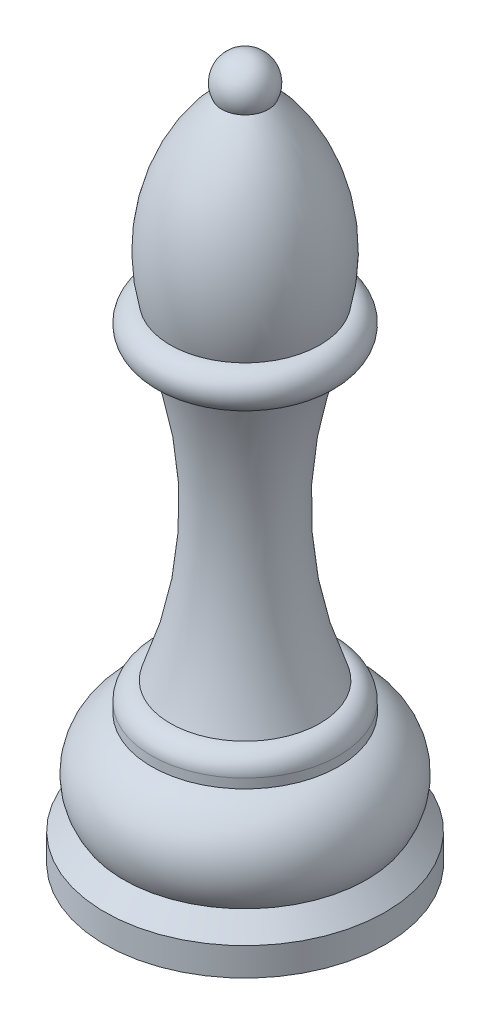
ISO-10303-21;
HEADER;
FILE_DESCRIPTION(('STEP AP214'),'2;1');
FILE_NAME('part.step','',(''),(''),'','','');
FILE_SCHEMA(('AUTOMOTIVE_DESIGN { 1 0 10303 214 1 1 1 1 }'));
ENDSEC;
DATA;
#1=APPLICATION_CONTEXT('core data for automotive mechanical design processes');
#2=APPLICATION_PROTOCOL_DEFINITION('international standard','automotive_design',2000,#1);
#3=PRODUCT_CONTEXT('',#1,'mechanical');
#4=PRODUCT('Part','Part','',(#3));
#5=PRODUCT_RELATED_PRODUCT_CATEGORY('part','',(#4));
#6=PRODUCT_DEFINITION_FORMATION('','',#4);
#7=PRODUCT_DEFINITION_CONTEXT('part definition',#1,'design');
#8=PRODUCT_DEFINITION('design','',#6,#7);
#9=PRODUCT_DEFINITION_SHAPE('','',#8);
#10=(LENGTH_UNIT() NAMED_UNIT(*) SI_UNIT(.MILLI.,.METRE.));
#11=(NAMED_UNIT(*) PLANE_ANGLE_UNIT() SI_UNIT($,.RADIAN.));
#12=(NAMED_UNIT(*) SI_UNIT($,.STERADIAN.) SOLID_ANGLE_UNIT());
#13=UNCERTAINTY_MEASURE_WITH_UNIT(LENGTH_MEASURE(1.E-05),#10,'distance_accuracy_value','');
#14=(GEOMETRIC_REPRESENTATION_CONTEXT(3) GLOBAL_UNCERTAINTY_ASSIGNED_CONTEXT((#13)) GLOBAL_UNIT_ASSIGNED_CONTEXT((#10,
#11,#12)) REPRESENTATION_CONTEXT('',''));
#15=CARTESIAN_POINT('',(0.,0.,0.));
#16=DIRECTION('',(0.,0.,1.));
#17=DIRECTION('',(1.,0.,0.));
#18=AXIS2_PLACEMENT_3D('',#15,#16,#17);
#19=CARTESIAN_POINT('',(-1.97758476261356E-13,56.7049655326048,0.));
#20=DIRECTION('',(0.,-1.,0.));
#21=DIRECTION('',(1.,0.,0.));
#22=AXIS2_PLACEMENT_3D('',#19,#20,#21);
#23=DEGENERATE_TOROIDAL_SURFACE('',#22,11.4362830815554,20.,.F.);
#24=CARTESIAN_POINT('',(-2.48069749124806E-13,71.0500000000001,0.));
#25=DIRECTION('',(0.,-1.,0.));
#26=DIRECTION('',(1.,0.,0.));
#27=AXIS2_PLACEMENT_3D('',#24,#25,#26);
#28=CIRCLE('',#27,2.49999999999975);
#29=CARTESIAN_POINT('',(2.4999999999995,71.0500000000001,0.));
#30=VERTEX_POINT('',#29);
#31=EDGE_CURVE('E82',#30,#30,#28,.T.);
#32=ORIENTED_EDGE('',*,*,#31,.T.);
#33=EDGE_LOOP('',(#32));
#34=FACE_BOUND('',#33,.T.);
#35=CARTESIAN_POINT('',(-1.81522114806455E-13,51.99,0.));
#36=DIRECTION('',(0.,-1.,0.));
#37=DIRECTION('',(1.,0.,0.));
#38=AXIS2_PLACEMENT_3D('',#35,#36,#37);
#39=CIRCLE('',#38,7.99999999999982);
#40=CARTESIAN_POINT('',(7.99999999999964,51.99,0.));
#41=VERTEX_POINT('',#40);
#42=EDGE_CURVE('E10',#41,#41,#39,.T.);
#43=ORIENTED_EDGE('',*,*,#42,.F.);
#44=EDGE_LOOP('',(#43));
#45=FACE_BOUND('',#44,.T.);
#46=ADVANCED_FACE('F39',(#34,#45),#23,.F.);
#47=CARTESIAN_POINT('',(-1.73472347597681E-13,49.99,0.));
#48=DIRECTION('',(0.,-1.,0.));
#49=DIRECTION('',(1.,0.,0.));
#50=AXIS2_PLACEMENT_3D('',#47,#48,#49);
#51=TOROIDAL_SURFACE('',#50,8.00000000004292,2.);
#52=ORIENTED_EDGE('',*,*,#42,.T.);
#53=EDGE_LOOP('',(#52));
#54=FACE_BOUND('',#53,.T.);
#55=CARTESIAN_POINT('',(-1.67556189451082E-13,47.99,0.));
#56=DIRECTION('',(0.,-1.,0.));
#57=DIRECTION('',(1.,0.,0.));
#58=AXIS2_PLACEMENT_3D('',#55,#56,#57);
#59=CIRCLE('',#58,8.00000000004292);
#60=CARTESIAN_POINT('',(8.00000000004276,47.99,0.));
#61=VERTEX_POINT('',#60);
#62=EDGE_CURVE('E46',#61,#61,#59,.T.);
#63=ORIENTED_EDGE('',*,*,#62,.F.);
#64=EDGE_LOOP('',(#63));
#65=FACE_BOUND('',#64,.T.);
#66=ADVANCED_FACE('F100',(#54,#65),#51,.T.);
#67=CARTESIAN_POINT('',(0.,47.99,0.));
#68=DIRECTION('',(0.,-1.,0.));
#69=DIRECTION('',(1.,0.,0.));
#70=AXIS2_PLACEMENT_3D('',#67,#68,#69);
#71=PLANE('',#70);
#72=ORIENTED_EDGE('',*,*,#62,.T.);
#73=EDGE_LOOP('',(#72));
#74=FACE_BOUND('',#73,.T.);
#75=CARTESIAN_POINT('',(-1.67556189451082E-13,47.99,0.));
#76=DIRECTION('',(0.,-1.,0.));
#77=DIRECTION('',(1.,0.,0.));
#78=AXIS2_PLACEMENT_3D('',#75,#76,#77);
#79=CIRCLE('',#78,7.49999999999983);
#80=CARTESIAN_POINT('',(7.49999999999967,47.99,0.));
#81=VERTEX_POINT('',#80);
#82=EDGE_CURVE('E51',#81,#81,#79,.T.);
#83=ORIENTED_EDGE('',*,*,#82,.F.);
#84=EDGE_LOOP('',(#83));
#85=FACE_BOUND('',#84,.T.);
#86=ADVANCED_FACE('F104',(#74,#85),#71,.T.);
#87=CARTESIAN_POINT('',(-1.17961196366423E-13,33.1607931199014,0.));
#88=DIRECTION('',(0.,-1.,0.));
#89=DIRECTION('',(1.,0.,0.));
#90=AXIS2_PLACEMENT_3D('',#87,#88,#89);
#91=TOROIDAL_SURFACE('',#90,49.9864051586766,45.);
#92=ORIENTED_EDGE('',*,*,#82,.T.);
#93=EDGE_LOOP('',(#92));
#94=FACE_BOUND('',#93,.T.);
#95=CARTESIAN_POINT('',(0.,16.97,0.));
#96=DIRECTION('',(0.,-1.,0.));
#97=DIRECTION('',(1.,0.,0.));
#98=AXIS2_PLACEMENT_3D('',#95,#96,#97);
#99=CIRCLE('',#98,7.99999999999994);
#100=CARTESIAN_POINT('',(7.99999999999988,16.9700000000001,0.));
#101=VERTEX_POINT('',#100);
#102=EDGE_CURVE('E56',#101,#101,#99,.T.);
#103=ORIENTED_EDGE('',*,*,#102,.F.);
#104=EDGE_LOOP('',(#103));
#105=FACE_BOUND('',#104,.T.);
#106=ADVANCED_FACE('F108',(#94,#105),#91,.F.);
#107=CARTESIAN_POINT('',(0.,14.97,0.));
#108=DIRECTION('',(0.,-1.,0.));
#109=DIRECTION('',(1.,0.,0.));
#110=AXIS2_PLACEMENT_3D('',#107,#108,#109);
#111=TOROIDAL_SURFACE('',#110,7.99999999999995,2.);
#112=ORIENTED_EDGE('',*,*,#102,.T.);
#113=EDGE_LOOP('',(#112));
#114=FACE_BOUND('',#113,.T.);
#115=CARTESIAN_POINT('',(0.,14.97,0.));
#116=DIRECTION('',(0.,-1.,0.));
#117=DIRECTION('',(1.,0.,0.));
#118=AXIS2_PLACEMENT_3D('',#115,#116,#117);
#119=CIRCLE('',#118,9.99999999999995);
#120=CARTESIAN_POINT('',(9.9999999999999,14.9700000000001,0.));
#121=VERTEX_POINT('',#120);
#122=EDGE_CURVE('E62',#121,#121,#119,.T.);
#123=ORIENTED_EDGE('',*,*,#122,.F.);
#124=EDGE_LOOP('',(#123));
#125=FACE_BOUND('',#124,.T.);
#126=ADVANCED_FACE('F114',(#114,#125),#111,.T.);
#127=CARTESIAN_POINT('',(1.88653052843492E-12,-540.32381827365,0.));
#128=DIRECTION('',(0.,-1.,0.));
#129=DIRECTION('',(1.,0.,0.));
#130=AXIS2_PLACEMENT_3D('',#127,#128,#129);
#131=CYLINDRICAL_SURFACE('',#130,9.99999999999995);
#132=ORIENTED_EDGE('',*,*,#122,.T.);
#133=EDGE_LOOP('',(#132));
#134=FACE_BOUND('',#133,.T.);
#135=CARTESIAN_POINT('',(0.,13.97,0.));
#136=DIRECTION('',(0.,-1.,0.));
#137=DIRECTION('',(1.,0.,0.));
#138=AXIS2_PLACEMENT_3D('',#135,#136,#137);
#139=CIRCLE('',#138,9.99999999999995);
#140=CARTESIAN_POINT('',(9.9999999999999,13.9700000000001,0.));
#141=VERTEX_POINT('',#140);
#142=EDGE_CURVE('E66',#141,#141,#139,.T.);
#143=ORIENTED_EDGE('',*,*,#142,.F.);
#144=EDGE_LOOP('',(#143));
#145=FACE_BOUND('',#144,.T.);
#146=ADVANCED_FACE('F118',(#134,#145),#131,.T.);
#147=CARTESIAN_POINT('',(0.,8.31380661428568,0.));
#148=DIRECTION('',(0.,-1.,0.));
#149=DIRECTION('',(1.,0.,0.));
#150=AXIS2_PLACEMENT_3D('',#147,#148,#149);
#151=TOROIDAL_SURFACE('',#150,7.99813177671415,6.);
#152=ORIENTED_EDGE('',*,*,#142,.T.);
#153=EDGE_LOOP('',(#152));
#154=FACE_BOUND('',#153,.T.);
#155=CARTESIAN_POINT('',(0.,5.,0.));
#156=DIRECTION('',(0.,-1.,0.));
#157=DIRECTION('',(1.,0.,0.));
#158=AXIS2_PLACEMENT_3D('',#155,#156,#157);
#159=CIRCLE('',#158,13.);
#160=CARTESIAN_POINT('',(13.,5.00000000000005,0.));
#161=VERTEX_POINT('',#160);
#162=EDGE_CURVE('E70',#161,#161,#159,.T.);
#163=ORIENTED_EDGE('',*,*,#162,.F.);
#164=EDGE_LOOP('',(#163));
#165=FACE_BOUND('',#164,.T.);
#166=ADVANCED_FACE('F122',(#154,#165),#151,.T.);
#167=CARTESIAN_POINT('',(0.,3.,0.));
#168=DIRECTION('',(0.,-1.,0.));
#169=DIRECTION('',(1.,0.,0.));
#170=AXIS2_PLACEMENT_3D('',#167,#168,#169);
#171=CONICAL_SURFACE('',#170,15.,0.78539816339745);
#172=ORIENTED_EDGE('',*,*,#162,.T.);
#173=EDGE_LOOP('',(#172));
#174=FACE_BOUND('',#173,.T.);
#175=CARTESIAN_POINT('',(0.,3.,0.));
#176=DIRECTION('',(0.,-1.,0.));
#177=DIRECTION('',(1.,0.,0.));
#178=AXIS2_PLACEMENT_3D('',#175,#176,#177);
#179=CIRCLE('',#178,15.);
#180=CARTESIAN_POINT('',(15.,3.00000000000006,0.));
#181=VERTEX_POINT('',#180);
#182=EDGE_CURVE('E74',#181,#181,#179,.T.);
#183=ORIENTED_EDGE('',*,*,#182,.F.);
#184=EDGE_LOOP('',(#183));
#185=FACE_BOUND('',#184,.T.);
#186=ADVANCED_FACE('F126',(#174,#185),#171,.T.);
#187=CARTESIAN_POINT('',(1.88653052843492E-12,-540.32381827365,0.));
#188=DIRECTION('',(0.,-1.,0.));
#189=DIRECTION('',(1.,0.,0.));
#190=AXIS2_PLACEMENT_3D('',#187,#188,#189);
#191=CYLINDRICAL_SURFACE('',#190,15.0000000000215);
#192=ORIENTED_EDGE('',*,*,#182,.T.);
#193=EDGE_LOOP('',(#192));
#194=FACE_BOUND('',#193,.T.);
#195=CARTESIAN_POINT('',(0.,0.,0.));
#196=DIRECTION('',(0.,-1.,0.));
#197=DIRECTION('',(1.,0.,0.));
#198=AXIS2_PLACEMENT_3D('',#195,#196,#197);
#199=CIRCLE('',#198,15.0000000000431);
#200=CARTESIAN_POINT('',(15.0000000000431,0.,0.));
#201=VERTEX_POINT('',#200);
#202=EDGE_CURVE('E78',#201,#201,#199,.T.);
#203=ORIENTED_EDGE('',*,*,#202,.F.);
#204=EDGE_LOOP('',(#203));
#205=FACE_BOUND('',#204,.T.);
#206=ADVANCED_FACE('F96',(#194,#205),#191,.T.);
#207=CARTESIAN_POINT('',(0.,0.,0.));
#208=DIRECTION('',(0.,-1.,0.));
#209=DIRECTION('',(1.,0.,0.));
#210=AXIS2_PLACEMENT_3D('',#207,#208,#209);
#211=PLANE('',#210);
#212=ORIENTED_EDGE('',*,*,#202,.T.);
#213=EDGE_LOOP('',(#212));
#214=FACE_BOUND('',#213,.T.);
#215=ADVANCED_FACE('F91',(#214),#211,.T.);
#216=CARTESIAN_POINT('',(0.,72.26875,0.));
#217=DIRECTION('',(0.,-1.,0.));
#218=DIRECTION('',(-1.,0.,0.));
#219=AXIS2_PLACEMENT_3D('',#216,#217,#218);
#220=SPHERICAL_SURFACE('',#219,2.78124999999998);
#221=ORIENTED_EDGE('',*,*,#31,.F.);
#222=EDGE_LOOP('',(#221));
#223=FACE_BOUND('',#222,.T.);
#224=ADVANCED_FACE('F89',(#223),#220,.T.);
#225=CLOSED_SHELL('',(#46,#66,#86,#106,#126,#146,#166,#186,#206,#215,#224));
#226=MANIFOLD_SOLID_BREP('B2',#225);
#227=ADVANCED_BREP_SHAPE_REPRESENTATION('',(#18,#226),#14);
#228=SHAPE_DEFINITION_REPRESENTATION(#9,#227);
ENDSEC;
END-ISO-10303-21;
